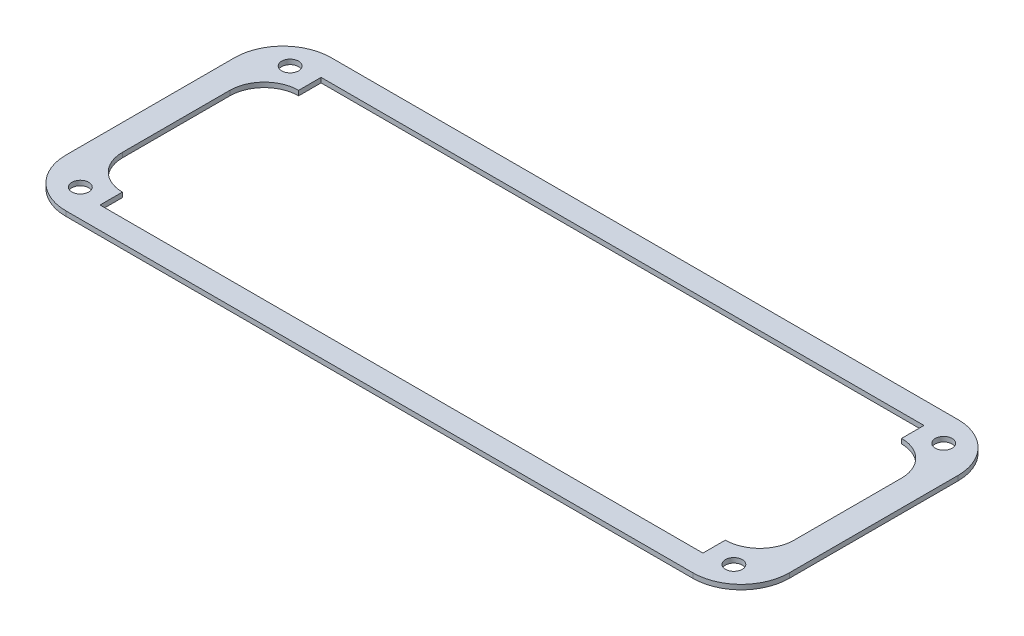
ISO-10303-21;
HEADER;
FILE_DESCRIPTION(('STEP AP214'),'2;1');
FILE_NAME('part.step','',(''),(''),'','','');
FILE_SCHEMA(('AUTOMOTIVE_DESIGN { 1 0 10303 214 1 1 1 1 }'));
ENDSEC;
DATA;
#1=APPLICATION_CONTEXT('core data for automotive mechanical design processes');
#2=APPLICATION_PROTOCOL_DEFINITION('international standard','automotive_design',2000,#1);
#3=PRODUCT_CONTEXT('',#1,'mechanical');
#4=PRODUCT('Part','Part','',(#3));
#5=PRODUCT_RELATED_PRODUCT_CATEGORY('part','',(#4));
#6=PRODUCT_DEFINITION_FORMATION('','',#4);
#7=PRODUCT_DEFINITION_CONTEXT('part definition',#1,'design');
#8=PRODUCT_DEFINITION('design','',#6,#7);
#9=PRODUCT_DEFINITION_SHAPE('','',#8);
#10=(LENGTH_UNIT() NAMED_UNIT(*) SI_UNIT(.MILLI.,.METRE.));
#11=(NAMED_UNIT(*) PLANE_ANGLE_UNIT() SI_UNIT($,.RADIAN.));
#12=(NAMED_UNIT(*) SI_UNIT($,.STERADIAN.) SOLID_ANGLE_UNIT());
#13=UNCERTAINTY_MEASURE_WITH_UNIT(LENGTH_MEASURE(1.E-05),#10,'distance_accuracy_value','');
#14=(GEOMETRIC_REPRESENTATION_CONTEXT(3) GLOBAL_UNCERTAINTY_ASSIGNED_CONTEXT((#13)) GLOBAL_UNIT_ASSIGNED_CONTEXT((#10,
#11,#12)) REPRESENTATION_CONTEXT('',''));
#15=CARTESIAN_POINT('',(0.,0.,0.));
#16=DIRECTION('',(0.,0.,1.));
#17=DIRECTION('',(1.,0.,0.));
#18=AXIS2_PLACEMENT_3D('',#15,#16,#17);
#19=CARTESIAN_POINT('',(132.75,1.,-4.25000000000001));
#20=DIRECTION('',(0.,1.,0.));
#21=DIRECTION('',(0.,0.,1.));
#22=AXIS2_PLACEMENT_3D('',#19,#20,#21);
#23=PLANE('',#22);
#24=CARTESIAN_POINT('',(135.5,1.,-43.5));
#25=DIRECTION('',(0.,1.,0.));
#26=DIRECTION('',(0.,0.,1.));
#27=AXIS2_PLACEMENT_3D('',#24,#25,#26);
#28=CIRCLE('',#27,1.75000000000001);
#29=CARTESIAN_POINT('',(135.5,1.,-41.75));
#30=VERTEX_POINT('',#29);
#31=EDGE_CURVE('E314',#30,#30,#28,.T.);
#32=ORIENTED_EDGE('',*,*,#31,.F.);
#33=EDGE_LOOP('',(#32));
#34=FACE_BOUND('',#33,.T.);
#35=CARTESIAN_POINT('',(0.,1.,0.));
#36=DIRECTION('',(0.,1.,0.));
#37=DIRECTION('',(0.,0.,1.));
#38=AXIS2_PLACEMENT_3D('',#35,#36,#37);
#39=CIRCLE('',#38,1.75);
#40=CARTESIAN_POINT('',(0.,1.,1.75));
#41=VERTEX_POINT('',#40);
#42=EDGE_CURVE('E330',#41,#41,#39,.T.);
#43=ORIENTED_EDGE('',*,*,#42,.F.);
#44=EDGE_LOOP('',(#43));
#45=FACE_BOUND('',#44,.T.);
#46=CARTESIAN_POINT('',(132.75,1.,-4.25000000000001));
#47=DIRECTION('',(0.,1.,0.));
#48=DIRECTION('',(0.,0.,1.));
#49=AXIS2_PLACEMENT_3D('',#46,#47,#48);
#50=CIRCLE('',#49,10.);
#51=CARTESIAN_POINT('',(132.75,1.,5.74999999999999));
#52=VERTEX_POINT('',#51);
#53=CARTESIAN_POINT('',(142.75,1.,-4.25000000000008));
#54=VERTEX_POINT('',#53);
#55=EDGE_CURVE('E338',#52,#54,#50,.T.);
#56=ORIENTED_EDGE('',*,*,#55,.T.);
#57=DIRECTION('',(0.,0.,-1.));
#58=VECTOR('',#57,1.);
#59=CARTESIAN_POINT('',(142.75,1.,-4.25000000000008));
#60=LINE('',#59,#58);
#61=CARTESIAN_POINT('',(142.75,1.,-39.2499999999999));
#62=VERTEX_POINT('',#61);
#63=EDGE_CURVE('E342',#54,#62,#60,.T.);
#64=ORIENTED_EDGE('',*,*,#63,.T.);
#65=CARTESIAN_POINT('',(132.75,1.,-39.25));
#66=DIRECTION('',(0.,1.,0.));
#67=DIRECTION('',(0.,0.,1.));
#68=AXIS2_PLACEMENT_3D('',#65,#66,#67);
#69=CIRCLE('',#68,10.);
#70=CARTESIAN_POINT('',(132.75,1.,-49.25));
#71=VERTEX_POINT('',#70);
#72=EDGE_CURVE('E346',#62,#71,#69,.T.);
#73=ORIENTED_EDGE('',*,*,#72,.T.);
#74=DIRECTION('',(-1.,0.,0.));
#75=VECTOR('',#74,1.);
#76=CARTESIAN_POINT('',(132.75,1.,-49.25));
#77=LINE('',#76,#75);
#78=CARTESIAN_POINT('',(2.75000000000011,1.,-49.25));
#79=VERTEX_POINT('',#78);
#80=EDGE_CURVE('E349',#71,#79,#77,.T.);
#81=ORIENTED_EDGE('',*,*,#80,.T.);
#82=CARTESIAN_POINT('',(2.75000000000004,1.,-39.25));
#83=DIRECTION('',(0.,1.,0.));
#84=DIRECTION('',(0.,0.,1.));
#85=AXIS2_PLACEMENT_3D('',#82,#83,#84);
#86=CIRCLE('',#85,10.);
#87=CARTESIAN_POINT('',(-7.24999999999996,1.,-39.2499999999999));
#88=VERTEX_POINT('',#87);
#89=EDGE_CURVE('E352',#79,#88,#86,.T.);
#90=ORIENTED_EDGE('',*,*,#89,.T.);
#91=DIRECTION('',(0.,0.,1.));
#92=VECTOR('',#91,1.);
#93=CARTESIAN_POINT('',(-7.24999999999996,1.,-4.25000000000006));
#94=LINE('',#93,#92);
#95=CARTESIAN_POINT('',(-7.24999999999996,1.,-4.25000000000006));
#96=VERTEX_POINT('',#95);
#97=EDGE_CURVE('E355',#88,#96,#94,.T.);
#98=ORIENTED_EDGE('',*,*,#97,.T.);
#99=CARTESIAN_POINT('',(2.75000000000003,1.,-4.24999999999999));
#100=DIRECTION('',(0.,1.,0.));
#101=DIRECTION('',(0.,0.,-1.));
#102=AXIS2_PLACEMENT_3D('',#99,#100,#101);
#103=CIRCLE('',#102,10.);
#104=CARTESIAN_POINT('',(2.75000000000011,1.,5.75000000000001));
#105=VERTEX_POINT('',#104);
#106=EDGE_CURVE('E358',#96,#105,#103,.T.);
#107=ORIENTED_EDGE('',*,*,#106,.T.);
#108=DIRECTION('',(1.,0.,0.));
#109=VECTOR('',#108,1.);
#110=CARTESIAN_POINT('',(132.75,1.,5.74999999999999));
#111=LINE('',#110,#109);
#112=EDGE_CURVE('E361',#105,#52,#111,.T.);
#113=ORIENTED_EDGE('',*,*,#112,.T.);
#114=EDGE_LOOP('',(#56,#64,#73,#81,#90,#98,#107,#113));
#115=FACE_BOUND('',#114,.T.);
#116=CARTESIAN_POINT('',(0.,1.,-43.5));
#117=DIRECTION('',(0.,1.,0.));
#118=DIRECTION('',(0.,0.,1.));
#119=AXIS2_PLACEMENT_3D('',#116,#117,#118);
#120=CIRCLE('',#119,1.75);
#121=CARTESIAN_POINT('',(0.,1.,-41.75));
#122=VERTEX_POINT('',#121);
#123=EDGE_CURVE('E322',#122,#122,#120,.T.);
#124=ORIENTED_EDGE('',*,*,#123,.F.);
#125=EDGE_LOOP('',(#124));
#126=FACE_BOUND('',#125,.T.);
#127=CARTESIAN_POINT('',(135.5,1.,0.));
#128=DIRECTION('',(0.,1.,0.));
#129=DIRECTION('',(0.,0.,1.));
#130=AXIS2_PLACEMENT_3D('',#127,#128,#129);
#131=CIRCLE('',#130,1.75000000000001);
#132=CARTESIAN_POINT('',(135.5,1.,1.75000000000001));
#133=VERTEX_POINT('',#132);
#134=EDGE_CURVE('E306',#133,#133,#131,.T.);
#135=ORIENTED_EDGE('',*,*,#134,.F.);
#136=EDGE_LOOP('',(#135));
#137=FACE_BOUND('',#136,.T.);
#138=CARTESIAN_POINT('',(5.25000000000002,1.,-32.8864434634646));
#139=DIRECTION('',(0.,1.,0.));
#140=DIRECTION('',(0.,0.,1.));
#141=AXIS2_PLACEMENT_3D('',#138,#139,#140);
#142=CIRCLE('',#141,7.13380773277468);
#143=CARTESIAN_POINT('',(5.25000000000002,1.,-40.0202511962393));
#144=VERTEX_POINT('',#143);
#145=CARTESIAN_POINT('',(-1.88380773277467,1.,-32.8864434634646));
#146=VERTEX_POINT('',#145);
#147=EDGE_CURVE('E186',#144,#146,#142,.T.);
#148=ORIENTED_EDGE('',*,*,#147,.F.);
#149=DIRECTION('',(0.,0.,1.));
#150=VECTOR('',#149,1.);
#151=CARTESIAN_POINT('',(5.25000000000002,1.,-40.0202511962393));
#152=LINE('',#151,#150);
#153=CARTESIAN_POINT('',(5.25000000000002,1.,-44.6666666666667));
#154=VERTEX_POINT('',#153);
#155=EDGE_CURVE('E177',#154,#144,#152,.T.);
#156=ORIENTED_EDGE('',*,*,#155,.F.);
#157=DIRECTION('',(-1.,0.,0.));
#158=VECTOR('',#157,1.);
#159=CARTESIAN_POINT('',(130.25,1.,-44.6666666666667));
#160=LINE('',#159,#158);
#161=CARTESIAN_POINT('',(130.25,1.,-44.6666666666667));
#162=VERTEX_POINT('',#161);
#163=EDGE_CURVE('E230',#162,#154,#160,.T.);
#164=ORIENTED_EDGE('',*,*,#163,.F.);
#165=DIRECTION('',(0.,0.,-1.));
#166=VECTOR('',#165,1.);
#167=CARTESIAN_POINT('',(130.25,1.,-40.0164434634646));
#168=LINE('',#167,#166);
#169=CARTESIAN_POINT('',(130.25,1.,-40.0164434634646));
#170=VERTEX_POINT('',#169);
#171=EDGE_CURVE('E227',#170,#162,#168,.T.);
#172=ORIENTED_EDGE('',*,*,#171,.F.);
#173=CARTESIAN_POINT('',(130.25,1.,-32.8864434634646));
#174=DIRECTION('',(0.,1.,0.));
#175=DIRECTION('',(0.,0.,1.));
#176=AXIS2_PLACEMENT_3D('',#173,#174,#175);
#177=CIRCLE('',#176,7.12999999999997);
#178=CARTESIAN_POINT('',(137.38,1.,-32.8864434634646));
#179=VERTEX_POINT('',#178);
#180=EDGE_CURVE('E224',#179,#170,#177,.T.);
#181=ORIENTED_EDGE('',*,*,#180,.F.);
#182=DIRECTION('',(0.,0.,-1.));
#183=VECTOR('',#182,1.);
#184=CARTESIAN_POINT('',(137.38,1.,-10.6135565365355));
#185=LINE('',#184,#183);
#186=CARTESIAN_POINT('',(137.38,1.,-10.6135565365355));
#187=VERTEX_POINT('',#186);
#188=EDGE_CURVE('E221',#187,#179,#185,.T.);
#189=ORIENTED_EDGE('',*,*,#188,.F.);
#190=CARTESIAN_POINT('',(130.25,1.,-10.6135565365354));
#191=DIRECTION('',(0.,1.,0.));
#192=DIRECTION('',(0.,0.,1.));
#193=AXIS2_PLACEMENT_3D('',#190,#191,#192);
#194=CIRCLE('',#193,7.12999999999997);
#195=CARTESIAN_POINT('',(130.25,1.,-3.48355653653547));
#196=VERTEX_POINT('',#195);
#197=EDGE_CURVE('E218',#196,#187,#194,.T.);
#198=ORIENTED_EDGE('',*,*,#197,.F.);
#199=DIRECTION('',(0.,0.,-1.));
#200=VECTOR('',#199,1.);
#201=CARTESIAN_POINT('',(130.25,1.,1.16666666666665));
#202=LINE('',#201,#200);
#203=CARTESIAN_POINT('',(130.25,1.,1.16666666666665));
#204=VERTEX_POINT('',#203);
#205=EDGE_CURVE('E215',#204,#196,#202,.T.);
#206=ORIENTED_EDGE('',*,*,#205,.F.);
#207=DIRECTION('',(1.,0.,0.));
#208=VECTOR('',#207,1.);
#209=CARTESIAN_POINT('',(130.25,1.,1.16666666666665));
#210=LINE('',#209,#208);
#211=CARTESIAN_POINT('',(5.25000000000002,1.,1.16666666666666));
#212=VERTEX_POINT('',#211);
#213=EDGE_CURVE('E212',#212,#204,#210,.T.);
#214=ORIENTED_EDGE('',*,*,#213,.F.);
#215=DIRECTION('',(0.,0.,1.));
#216=VECTOR('',#215,1.);
#217=CARTESIAN_POINT('',(5.25000000000002,1.,1.16666666666666));
#218=LINE('',#217,#216);
#219=CARTESIAN_POINT('',(5.25000000000002,1.,-3.47974880376073));
#220=VERTEX_POINT('',#219);
#221=EDGE_CURVE('E209',#220,#212,#218,.T.);
#222=ORIENTED_EDGE('',*,*,#221,.F.);
#223=CARTESIAN_POINT('',(5.25000000000002,1.,-10.6135565365354));
#224=DIRECTION('',(0.,1.,0.));
#225=DIRECTION('',(0.,0.,1.));
#226=AXIS2_PLACEMENT_3D('',#223,#224,#225);
#227=CIRCLE('',#226,7.13380773277468);
#228=CARTESIAN_POINT('',(-1.88380773277466,1.,-10.6135565365354));
#229=VERTEX_POINT('',#228);
#230=EDGE_CURVE('E204',#229,#220,#227,.T.);
#231=ORIENTED_EDGE('',*,*,#230,.F.);
#232=DIRECTION('',(0.,0.,1.));
#233=VECTOR('',#232,1.);
#234=CARTESIAN_POINT('',(-1.88380773277466,1.,-10.6135565365354));
#235=LINE('',#234,#233);
#236=EDGE_CURVE('E200',#146,#229,#235,.T.);
#237=ORIENTED_EDGE('',*,*,#236,.F.);
#238=EDGE_LOOP('',(#148,#156,#164,#172,#181,#189,#198,#206,#214,#222,#231,#237));
#239=FACE_BOUND('',#238,.T.);
#240=ADVANCED_FACE('F39',(#34,#45,#115,#126,#137,#239),#23,.T.);
#241=CARTESIAN_POINT('',(132.75,0.,-4.25000000000001));
#242=DIRECTION('',(0.,1.,0.));
#243=DIRECTION('',(0.,0.,1.));
#244=AXIS2_PLACEMENT_3D('',#241,#242,#243);
#245=PLANE('',#244);
#246=CARTESIAN_POINT('',(135.5,0.,0.));
#247=DIRECTION('',(0.,1.,0.));
#248=DIRECTION('',(0.,0.,1.));
#249=AXIS2_PLACEMENT_3D('',#246,#247,#248);
#250=CIRCLE('',#249,1.75000000000001);
#251=CARTESIAN_POINT('',(135.5,0.,1.75000000000001));
#252=VERTEX_POINT('',#251);
#253=EDGE_CURVE('E195',#252,#252,#250,.T.);
#254=ORIENTED_EDGE('',*,*,#253,.T.);
#255=EDGE_LOOP('',(#254));
#256=FACE_BOUND('',#255,.T.);
#257=CARTESIAN_POINT('',(135.5,0.,-43.5));
#258=DIRECTION('',(0.,1.,0.));
#259=DIRECTION('',(0.,0.,1.));
#260=AXIS2_PLACEMENT_3D('',#257,#258,#259);
#261=CIRCLE('',#260,1.75000000000001);
#262=CARTESIAN_POINT('',(135.5,0.,-41.75));
#263=VERTEX_POINT('',#262);
#264=EDGE_CURVE('E310',#263,#263,#261,.T.);
#265=ORIENTED_EDGE('',*,*,#264,.T.);
#266=EDGE_LOOP('',(#265));
#267=FACE_BOUND('',#266,.T.);
#268=CARTESIAN_POINT('',(0.,0.,-43.5));
#269=DIRECTION('',(0.,1.,0.));
#270=DIRECTION('',(0.,0.,1.));
#271=AXIS2_PLACEMENT_3D('',#268,#269,#270);
#272=CIRCLE('',#271,1.75);
#273=CARTESIAN_POINT('',(0.,0.,-41.75));
#274=VERTEX_POINT('',#273);
#275=EDGE_CURVE('E318',#274,#274,#272,.T.);
#276=ORIENTED_EDGE('',*,*,#275,.T.);
#277=EDGE_LOOP('',(#276));
#278=FACE_BOUND('',#277,.T.);
#279=CARTESIAN_POINT('',(0.,0.,0.));
#280=DIRECTION('',(0.,1.,0.));
#281=DIRECTION('',(0.,0.,1.));
#282=AXIS2_PLACEMENT_3D('',#279,#280,#281);
#283=CIRCLE('',#282,1.75);
#284=CARTESIAN_POINT('',(0.,0.,1.75));
#285=VERTEX_POINT('',#284);
#286=EDGE_CURVE('E326',#285,#285,#283,.T.);
#287=ORIENTED_EDGE('',*,*,#286,.T.);
#288=EDGE_LOOP('',(#287));
#289=FACE_BOUND('',#288,.T.);
#290=CARTESIAN_POINT('',(132.75,0.,-4.25000000000001));
#291=DIRECTION('',(0.,1.,0.));
#292=DIRECTION('',(0.,0.,1.));
#293=AXIS2_PLACEMENT_3D('',#290,#291,#292);
#294=CIRCLE('',#293,10.);
#295=CARTESIAN_POINT('',(132.75,0.,5.74999999999999));
#296=VERTEX_POINT('',#295);
#297=CARTESIAN_POINT('',(142.75,0.,-4.25000000000008));
#298=VERTEX_POINT('',#297);
#299=EDGE_CURVE('E334',#296,#298,#294,.T.);
#300=ORIENTED_EDGE('',*,*,#299,.F.);
#301=DIRECTION('',(1.,0.,0.));
#302=VECTOR('',#301,1.);
#303=CARTESIAN_POINT('',(132.75,0.,5.74999999999999));
#304=LINE('',#303,#302);
#305=CARTESIAN_POINT('',(2.75000000000011,0.,5.75000000000001));
#306=VERTEX_POINT('',#305);
#307=EDGE_CURVE('E343',#306,#296,#304,.T.);
#308=ORIENTED_EDGE('',*,*,#307,.F.);
#309=CARTESIAN_POINT('',(2.75000000000003,0.,-4.24999999999999));
#310=DIRECTION('',(0.,1.,0.));
#311=DIRECTION('',(0.,0.,-1.));
#312=AXIS2_PLACEMENT_3D('',#309,#310,#311);
#313=CIRCLE('',#312,10.);
#314=CARTESIAN_POINT('',(-7.24999999999996,0.,-4.25000000000006));
#315=VERTEX_POINT('',#314);
#316=EDGE_CURVE('E383',#315,#306,#313,.T.);
#317=ORIENTED_EDGE('',*,*,#316,.F.);
#318=DIRECTION('',(0.,0.,1.));
#319=VECTOR('',#318,1.);
#320=CARTESIAN_POINT('',(-7.24999999999996,0.,-4.25000000000006));
#321=LINE('',#320,#319);
#322=CARTESIAN_POINT('',(-7.24999999999996,0.,-39.2499999999999));
#323=VERTEX_POINT('',#322);
#324=EDGE_CURVE('E380',#323,#315,#321,.T.);
#325=ORIENTED_EDGE('',*,*,#324,.F.);
#326=CARTESIAN_POINT('',(2.75000000000004,0.,-39.25));
#327=DIRECTION('',(0.,1.,0.));
#328=DIRECTION('',(0.,0.,1.));
#329=AXIS2_PLACEMENT_3D('',#326,#327,#328);
#330=CIRCLE('',#329,10.);
#331=CARTESIAN_POINT('',(2.75000000000011,0.,-49.25));
#332=VERTEX_POINT('',#331);
#333=EDGE_CURVE('E377',#332,#323,#330,.T.);
#334=ORIENTED_EDGE('',*,*,#333,.F.);
#335=DIRECTION('',(-1.,0.,0.));
#336=VECTOR('',#335,1.);
#337=CARTESIAN_POINT('',(132.75,0.,-49.25));
#338=LINE('',#337,#336);
#339=CARTESIAN_POINT('',(132.75,0.,-49.25));
#340=VERTEX_POINT('',#339);
#341=EDGE_CURVE('E374',#340,#332,#338,.T.);
#342=ORIENTED_EDGE('',*,*,#341,.F.);
#343=CARTESIAN_POINT('',(132.75,0.,-39.25));
#344=DIRECTION('',(0.,1.,0.));
#345=DIRECTION('',(0.,0.,1.));
#346=AXIS2_PLACEMENT_3D('',#343,#344,#345);
#347=CIRCLE('',#346,10.);
#348=CARTESIAN_POINT('',(142.75,0.,-39.2499999999999));
#349=VERTEX_POINT('',#348);
#350=EDGE_CURVE('E371',#349,#340,#347,.T.);
#351=ORIENTED_EDGE('',*,*,#350,.F.);
#352=DIRECTION('',(0.,0.,-1.));
#353=VECTOR('',#352,1.);
#354=CARTESIAN_POINT('',(142.75,0.,-4.25000000000008));
#355=LINE('',#354,#353);
#356=EDGE_CURVE('E368',#298,#349,#355,.T.);
#357=ORIENTED_EDGE('',*,*,#356,.F.);
#358=EDGE_LOOP('',(#300,#308,#317,#325,#334,#342,#351,#357));
#359=FACE_BOUND('',#358,.T.);
#360=DIRECTION('',(0.,0.,1.));
#361=VECTOR('',#360,1.);
#362=CARTESIAN_POINT('',(5.25000000000002,0.,-40.0202511962393));
#363=LINE('',#362,#361);
#364=CARTESIAN_POINT('',(5.25,0.,-44.6666666666667));
#365=VERTEX_POINT('',#364);
#366=CARTESIAN_POINT('',(5.25000000000002,0.,-40.0202511962393));
#367=VERTEX_POINT('',#366);
#368=EDGE_CURVE('E63',#365,#367,#363,.T.);
#369=ORIENTED_EDGE('',*,*,#368,.T.);
#370=CARTESIAN_POINT('',(5.25000000000002,0.,-32.8864434634646));
#371=DIRECTION('',(0.,1.,0.));
#372=DIRECTION('',(0.,0.,1.));
#373=AXIS2_PLACEMENT_3D('',#370,#371,#372);
#374=CIRCLE('',#373,7.13380773277468);
#375=CARTESIAN_POINT('',(-1.88380773277467,0.,-32.8864434634646));
#376=VERTEX_POINT('',#375);
#377=EDGE_CURVE('E193',#367,#376,#374,.T.);
#378=ORIENTED_EDGE('',*,*,#377,.T.);
#379=DIRECTION('',(0.,0.,1.));
#380=VECTOR('',#379,1.);
#381=CARTESIAN_POINT('',(-1.88380773277466,0.,-10.6135565365354));
#382=LINE('',#381,#380);
#383=CARTESIAN_POINT('',(-1.88380773277466,0.,-10.6135565365354));
#384=VERTEX_POINT('',#383);
#385=EDGE_CURVE('E237',#376,#384,#382,.T.);
#386=ORIENTED_EDGE('',*,*,#385,.T.);
#387=CARTESIAN_POINT('',(5.25000000000002,0.,-10.6135565365354));
#388=DIRECTION('',(0.,1.,0.));
#389=DIRECTION('',(0.,0.,1.));
#390=AXIS2_PLACEMENT_3D('',#387,#388,#389);
#391=CIRCLE('',#390,7.13380773277468);
#392=CARTESIAN_POINT('',(5.25000000000002,0.,-3.47974880376073));
#393=VERTEX_POINT('',#392);
#394=EDGE_CURVE('E241',#384,#393,#391,.T.);
#395=ORIENTED_EDGE('',*,*,#394,.T.);
#396=DIRECTION('',(0.,0.,1.));
#397=VECTOR('',#396,1.);
#398=CARTESIAN_POINT('',(5.25000000000002,0.,1.16666666666666));
#399=LINE('',#398,#397);
#400=CARTESIAN_POINT('',(5.25000000000002,0.,1.16666666666666));
#401=VERTEX_POINT('',#400);
#402=EDGE_CURVE('E245',#393,#401,#399,.T.);
#403=ORIENTED_EDGE('',*,*,#402,.T.);
#404=DIRECTION('',(1.,0.,0.));
#405=VECTOR('',#404,1.);
#406=CARTESIAN_POINT('',(130.25,0.,1.16666666666665));
#407=LINE('',#406,#405);
#408=CARTESIAN_POINT('',(130.25,0.,1.16666666666665));
#409=VERTEX_POINT('',#408);
#410=EDGE_CURVE('E249',#401,#409,#407,.T.);
#411=ORIENTED_EDGE('',*,*,#410,.T.);
#412=DIRECTION('',(0.,0.,-1.));
#413=VECTOR('',#412,1.);
#414=CARTESIAN_POINT('',(130.25,0.,1.16666666666665));
#415=LINE('',#414,#413);
#416=CARTESIAN_POINT('',(130.25,0.,-3.48355653653547));
#417=VERTEX_POINT('',#416);
#418=EDGE_CURVE('E253',#409,#417,#415,.T.);
#419=ORIENTED_EDGE('',*,*,#418,.T.);
#420=CARTESIAN_POINT('',(130.25,0.,-10.6135565365354));
#421=DIRECTION('',(0.,1.,0.));
#422=DIRECTION('',(0.,0.,1.));
#423=AXIS2_PLACEMENT_3D('',#420,#421,#422);
#424=CIRCLE('',#423,7.12999999999997);
#425=CARTESIAN_POINT('',(137.38,0.,-10.6135565365355));
#426=VERTEX_POINT('',#425);
#427=EDGE_CURVE('E257',#417,#426,#424,.T.);
#428=ORIENTED_EDGE('',*,*,#427,.T.);
#429=DIRECTION('',(0.,0.,-1.));
#430=VECTOR('',#429,1.);
#431=CARTESIAN_POINT('',(137.38,0.,-10.6135565365355));
#432=LINE('',#431,#430);
#433=CARTESIAN_POINT('',(137.38,0.,-32.8864434634646));
#434=VERTEX_POINT('',#433);
#435=EDGE_CURVE('E261',#426,#434,#432,.T.);
#436=ORIENTED_EDGE('',*,*,#435,.T.);
#437=CARTESIAN_POINT('',(130.25,0.,-32.8864434634646));
#438=DIRECTION('',(0.,1.,0.));
#439=DIRECTION('',(0.,0.,1.));
#440=AXIS2_PLACEMENT_3D('',#437,#438,#439);
#441=CIRCLE('',#440,7.12999999999997);
#442=CARTESIAN_POINT('',(130.25,0.,-40.0164434634646));
#443=VERTEX_POINT('',#442);
#444=EDGE_CURVE('E265',#434,#443,#441,.T.);
#445=ORIENTED_EDGE('',*,*,#444,.T.);
#446=DIRECTION('',(0.,0.,-1.));
#447=VECTOR('',#446,1.);
#448=CARTESIAN_POINT('',(130.25,0.,-40.0164434634646));
#449=LINE('',#448,#447);
#450=CARTESIAN_POINT('',(130.25,0.,-44.6666666666667));
#451=VERTEX_POINT('',#450);
#452=EDGE_CURVE('E269',#443,#451,#449,.T.);
#453=ORIENTED_EDGE('',*,*,#452,.T.);
#454=DIRECTION('',(-1.,0.,0.));
#455=VECTOR('',#454,1.);
#456=CARTESIAN_POINT('',(130.25,0.,-44.6666666666667));
#457=LINE('',#456,#455);
#458=EDGE_CURVE('E187',#451,#365,#457,.T.);
#459=ORIENTED_EDGE('',*,*,#458,.T.);
#460=EDGE_LOOP('',(#369,#378,#386,#395,#403,#411,#419,#428,#436,#445,#453,#459));
#461=FACE_BOUND('',#460,.T.);
#462=ADVANCED_FACE('F422',(#256,#267,#278,#289,#359,#461),#245,.F.);
#463=CARTESIAN_POINT('',(132.75,1.,-4.25000000000001));
#464=DIRECTION('',(0.,-1.,0.));
#465=DIRECTION('',(0.,0.,-1.));
#466=AXIS2_PLACEMENT_3D('',#463,#464,#465);
#467=CYLINDRICAL_SURFACE('',#466,10.);
#468=ORIENTED_EDGE('',*,*,#299,.T.);
#469=DIRECTION('',(0.,-1.,0.));
#470=VECTOR('',#469,1.);
#471=CARTESIAN_POINT('',(142.75,1.,-4.25000000000008));
#472=LINE('',#471,#470);
#473=EDGE_CURVE('E11',#54,#298,#472,.T.);
#474=ORIENTED_EDGE('',*,*,#473,.F.);
#475=ORIENTED_EDGE('',*,*,#55,.F.);
#476=DIRECTION('',(0.,-1.,0.));
#477=VECTOR('',#476,1.);
#478=CARTESIAN_POINT('',(132.75,1.,5.74999999999999));
#479=LINE('',#478,#477);
#480=EDGE_CURVE('E364',#52,#296,#479,.T.);
#481=ORIENTED_EDGE('',*,*,#480,.T.);
#482=EDGE_LOOP('',(#468,#474,#475,#481));
#483=FACE_BOUND('',#482,.T.);
#484=ADVANCED_FACE('F41',(#483),#467,.T.);
#485=CARTESIAN_POINT('',(142.75,1.,-4.25000000000008));
#486=DIRECTION('',(-1.,0.,0.));
#487=DIRECTION('',(0.,0.,1.));
#488=AXIS2_PLACEMENT_3D('',#485,#486,#487);
#489=PLANE('',#488);
#490=ORIENTED_EDGE('',*,*,#356,.T.);
#491=DIRECTION('',(0.,-1.,0.));
#492=VECTOR('',#491,1.);
#493=CARTESIAN_POINT('',(142.75,1.,-39.2499999999999));
#494=LINE('',#493,#492);
#495=EDGE_CURVE('E48',#62,#349,#494,.T.);
#496=ORIENTED_EDGE('',*,*,#495,.F.);
#497=ORIENTED_EDGE('',*,*,#63,.F.);
#498=ORIENTED_EDGE('',*,*,#473,.T.);
#499=EDGE_LOOP('',(#490,#496,#497,#498));
#500=FACE_BOUND('',#499,.T.);
#501=ADVANCED_FACE('F440',(#500),#489,.F.);
#502=CARTESIAN_POINT('',(132.75,1.,-39.25));
#503=DIRECTION('',(0.,-1.,0.));
#504=DIRECTION('',(0.,0.,-1.));
#505=AXIS2_PLACEMENT_3D('',#502,#503,#504);
#506=CYLINDRICAL_SURFACE('',#505,10.);
#507=ORIENTED_EDGE('',*,*,#350,.T.);
#508=DIRECTION('',(0.,-1.,0.));
#509=VECTOR('',#508,1.);
#510=CARTESIAN_POINT('',(132.75,1.,-49.25));
#511=LINE('',#510,#509);
#512=EDGE_CURVE('E407',#71,#340,#511,.T.);
#513=ORIENTED_EDGE('',*,*,#512,.F.);
#514=ORIENTED_EDGE('',*,*,#72,.F.);
#515=ORIENTED_EDGE('',*,*,#495,.T.);
#516=EDGE_LOOP('',(#507,#513,#514,#515));
#517=FACE_BOUND('',#516,.T.);
#518=ADVANCED_FACE('F416',(#517),#506,.T.);
#519=CARTESIAN_POINT('',(132.75,1.,-49.25));
#520=DIRECTION('',(0.,0.,1.));
#521=DIRECTION('',(1.,0.,0.));
#522=AXIS2_PLACEMENT_3D('',#519,#520,#521);
#523=PLANE('',#522);
#524=ORIENTED_EDGE('',*,*,#341,.T.);
#525=DIRECTION('',(0.,-1.,0.));
#526=VECTOR('',#525,1.);
#527=CARTESIAN_POINT('',(2.75000000000011,1.,-49.25));
#528=LINE('',#527,#526);
#529=EDGE_CURVE('E403',#79,#332,#528,.T.);
#530=ORIENTED_EDGE('',*,*,#529,.F.);
#531=ORIENTED_EDGE('',*,*,#80,.F.);
#532=ORIENTED_EDGE('',*,*,#512,.T.);
#533=EDGE_LOOP('',(#524,#530,#531,#532));
#534=FACE_BOUND('',#533,.T.);
#535=ADVANCED_FACE('F428',(#534),#523,.F.);
#536=CARTESIAN_POINT('',(2.75000000000004,1.,-39.25));
#537=DIRECTION('',(0.,-1.,0.));
#538=DIRECTION('',(0.,0.,-1.));
#539=AXIS2_PLACEMENT_3D('',#536,#537,#538);
#540=CYLINDRICAL_SURFACE('',#539,10.);
#541=ORIENTED_EDGE('',*,*,#333,.T.);
#542=DIRECTION('',(0.,-1.,0.));
#543=VECTOR('',#542,1.);
#544=CARTESIAN_POINT('',(-7.24999999999996,1.,-39.2499999999999));
#545=LINE('',#544,#543);
#546=EDGE_CURVE('E399',#88,#323,#545,.T.);
#547=ORIENTED_EDGE('',*,*,#546,.F.);
#548=ORIENTED_EDGE('',*,*,#89,.F.);
#549=ORIENTED_EDGE('',*,*,#529,.T.);
#550=EDGE_LOOP('',(#541,#547,#548,#549));
#551=FACE_BOUND('',#550,.T.);
#552=ADVANCED_FACE('F432',(#551),#540,.T.);
#553=CARTESIAN_POINT('',(-7.24999999999996,1.,-4.25000000000006));
#554=DIRECTION('',(1.,0.,0.));
#555=DIRECTION('',(0.,0.,-1.));
#556=AXIS2_PLACEMENT_3D('',#553,#554,#555);
#557=PLANE('',#556);
#558=ORIENTED_EDGE('',*,*,#324,.T.);
#559=DIRECTION('',(0.,-1.,0.));
#560=VECTOR('',#559,1.);
#561=CARTESIAN_POINT('',(-7.24999999999996,1.,-4.25000000000006));
#562=LINE('',#561,#560);
#563=EDGE_CURVE('E395',#96,#315,#562,.T.);
#564=ORIENTED_EDGE('',*,*,#563,.F.);
#565=ORIENTED_EDGE('',*,*,#97,.F.);
#566=ORIENTED_EDGE('',*,*,#546,.T.);
#567=EDGE_LOOP('',(#558,#564,#565,#566));
#568=FACE_BOUND('',#567,.T.);
#569=ADVANCED_FACE('F453',(#568),#557,.F.);
#570=CARTESIAN_POINT('',(2.75000000000003,1.,-4.24999999999999));
#571=DIRECTION('',(0.,-1.,0.));
#572=DIRECTION('',(0.,0.,-1.));
#573=AXIS2_PLACEMENT_3D('',#570,#571,#572);
#574=CYLINDRICAL_SURFACE('',#573,10.);
#575=ORIENTED_EDGE('',*,*,#316,.T.);
#576=DIRECTION('',(0.,-1.,0.));
#577=VECTOR('',#576,1.);
#578=CARTESIAN_POINT('',(2.75000000000011,1.,5.75000000000001));
#579=LINE('',#578,#577);
#580=EDGE_CURVE('E391',#105,#306,#579,.T.);
#581=ORIENTED_EDGE('',*,*,#580,.F.);
#582=ORIENTED_EDGE('',*,*,#106,.F.);
#583=ORIENTED_EDGE('',*,*,#563,.T.);
#584=EDGE_LOOP('',(#575,#581,#582,#583));
#585=FACE_BOUND('',#584,.T.);
#586=ADVANCED_FACE('F451',(#585),#574,.T.);
#587=CARTESIAN_POINT('',(132.75,1.,5.74999999999999));
#588=DIRECTION('',(0.,0.,-1.));
#589=DIRECTION('',(-1.,0.,0.));
#590=AXIS2_PLACEMENT_3D('',#587,#588,#589);
#591=PLANE('',#590);
#592=ORIENTED_EDGE('',*,*,#307,.T.);
#593=ORIENTED_EDGE('',*,*,#480,.F.);
#594=ORIENTED_EDGE('',*,*,#112,.F.);
#595=ORIENTED_EDGE('',*,*,#580,.T.);
#596=EDGE_LOOP('',(#592,#593,#594,#595));
#597=FACE_BOUND('',#596,.T.);
#598=ADVANCED_FACE('F446',(#597),#591,.F.);
#599=CARTESIAN_POINT('',(0.,1.,0.));
#600=DIRECTION('',(0.,-1.,0.));
#601=DIRECTION('',(0.,0.,-1.));
#602=AXIS2_PLACEMENT_3D('',#599,#600,#601);
#603=CYLINDRICAL_SURFACE('',#602,1.75);
#604=ORIENTED_EDGE('',*,*,#42,.T.);
#605=EDGE_LOOP('',(#604));
#606=FACE_BOUND('',#605,.T.);
#607=ORIENTED_EDGE('',*,*,#286,.F.);
#608=EDGE_LOOP('',(#607));
#609=FACE_BOUND('',#608,.T.);
#610=ADVANCED_FACE('F473',(#606,#609),#603,.F.);
#611=CARTESIAN_POINT('',(0.,1.,-43.5));
#612=DIRECTION('',(0.,-1.,0.));
#613=DIRECTION('',(0.,0.,-1.));
#614=AXIS2_PLACEMENT_3D('',#611,#612,#613);
#615=CYLINDRICAL_SURFACE('',#614,1.75);
#616=ORIENTED_EDGE('',*,*,#123,.T.);
#617=EDGE_LOOP('',(#616));
#618=FACE_BOUND('',#617,.T.);
#619=ORIENTED_EDGE('',*,*,#275,.F.);
#620=EDGE_LOOP('',(#619));
#621=FACE_BOUND('',#620,.T.);
#622=ADVANCED_FACE('F480',(#618,#621),#615,.F.);
#623=CARTESIAN_POINT('',(135.5,1.,-43.5));
#624=DIRECTION('',(0.,-1.,0.));
#625=DIRECTION('',(0.,0.,-1.));
#626=AXIS2_PLACEMENT_3D('',#623,#624,#625);
#627=CYLINDRICAL_SURFACE('',#626,1.75000000000001);
#628=ORIENTED_EDGE('',*,*,#31,.T.);
#629=EDGE_LOOP('',(#628));
#630=FACE_BOUND('',#629,.T.);
#631=ORIENTED_EDGE('',*,*,#264,.F.);
#632=EDGE_LOOP('',(#631));
#633=FACE_BOUND('',#632,.T.);
#634=ADVANCED_FACE('F485',(#630,#633),#627,.F.);
#635=CARTESIAN_POINT('',(135.5,1.,0.));
#636=DIRECTION('',(0.,-1.,0.));
#637=DIRECTION('',(0.,0.,-1.));
#638=AXIS2_PLACEMENT_3D('',#635,#636,#637);
#639=CYLINDRICAL_SURFACE('',#638,1.75000000000001);
#640=ORIENTED_EDGE('',*,*,#134,.T.);
#641=EDGE_LOOP('',(#640));
#642=FACE_BOUND('',#641,.T.);
#643=ORIENTED_EDGE('',*,*,#253,.F.);
#644=EDGE_LOOP('',(#643));
#645=FACE_BOUND('',#644,.T.);
#646=ADVANCED_FACE('F494',(#642,#645),#639,.F.);
#647=CARTESIAN_POINT('',(5.25000000000002,1.,-40.0202511962393));
#648=DIRECTION('',(1.,0.,0.));
#649=DIRECTION('',(0.,0.,-1.));
#650=AXIS2_PLACEMENT_3D('',#647,#648,#649);
#651=PLANE('',#650);
#652=ORIENTED_EDGE('',*,*,#368,.F.);
#653=DIRECTION('',(0.,-1.,0.));
#654=VECTOR('',#653,1.);
#655=CARTESIAN_POINT('',(5.25000000000002,1.,-44.6666666666667));
#656=LINE('',#655,#654);
#657=EDGE_CURVE('E181',#154,#365,#656,.T.);
#658=ORIENTED_EDGE('',*,*,#657,.F.);
#659=ORIENTED_EDGE('',*,*,#155,.T.);
#660=DIRECTION('',(0.,-1.,0.));
#661=VECTOR('',#660,1.);
#662=CARTESIAN_POINT('',(5.25000000000002,1.,-40.0202511962393));
#663=LINE('',#662,#661);
#664=EDGE_CURVE('E180',#144,#367,#663,.T.);
#665=ORIENTED_EDGE('',*,*,#664,.T.);
#666=EDGE_LOOP('',(#652,#658,#659,#665));
#667=FACE_BOUND('',#666,.T.);
#668=ADVANCED_FACE('F179',(#667),#651,.T.);
#669=CARTESIAN_POINT('',(5.25000000000002,1.,-32.8864434634646));
#670=DIRECTION('',(0.,-1.,0.));
#671=DIRECTION('',(0.,0.,-1.));
#672=AXIS2_PLACEMENT_3D('',#669,#670,#671);
#673=CYLINDRICAL_SURFACE('',#672,7.13380773277468);
#674=ORIENTED_EDGE('',*,*,#377,.F.);
#675=ORIENTED_EDGE('',*,*,#664,.F.);
#676=ORIENTED_EDGE('',*,*,#147,.T.);
#677=DIRECTION('',(0.,-1.,0.));
#678=VECTOR('',#677,1.);
#679=CARTESIAN_POINT('',(-1.88380773277467,1.,-32.8864434634646));
#680=LINE('',#679,#678);
#681=EDGE_CURVE('E196',#146,#376,#680,.T.);
#682=ORIENTED_EDGE('',*,*,#681,.T.);
#683=EDGE_LOOP('',(#674,#675,#676,#682));
#684=FACE_BOUND('',#683,.T.);
#685=ADVANCED_FACE('F190',(#684),#673,.F.);
#686=CARTESIAN_POINT('',(-1.88380773277466,1.,-10.6135565365354));
#687=DIRECTION('',(1.,0.,0.));
#688=DIRECTION('',(0.,0.,-1.));
#689=AXIS2_PLACEMENT_3D('',#686,#687,#688);
#690=PLANE('',#689);
#691=ORIENTED_EDGE('',*,*,#385,.F.);
#692=ORIENTED_EDGE('',*,*,#681,.F.);
#693=ORIENTED_EDGE('',*,*,#236,.T.);
#694=DIRECTION('',(0.,-1.,0.));
#695=VECTOR('',#694,1.);
#696=CARTESIAN_POINT('',(-1.88380773277466,1.,-10.6135565365354));
#697=LINE('',#696,#695);
#698=EDGE_CURVE('E301',#229,#384,#697,.T.);
#699=ORIENTED_EDGE('',*,*,#698,.T.);
#700=EDGE_LOOP('',(#691,#692,#693,#699));
#701=FACE_BOUND('',#700,.T.);
#702=ADVANCED_FACE('F506',(#701),#690,.T.);
#703=CARTESIAN_POINT('',(5.25000000000002,1.,-10.6135565365354));
#704=DIRECTION('',(0.,-1.,0.));
#705=DIRECTION('',(0.,0.,-1.));
#706=AXIS2_PLACEMENT_3D('',#703,#704,#705);
#707=CYLINDRICAL_SURFACE('',#706,7.13380773277468);
#708=ORIENTED_EDGE('',*,*,#394,.F.);
#709=ORIENTED_EDGE('',*,*,#698,.F.);
#710=ORIENTED_EDGE('',*,*,#230,.T.);
#711=DIRECTION('',(0.,-1.,0.));
#712=VECTOR('',#711,1.);
#713=CARTESIAN_POINT('',(5.25000000000002,1.,-3.47974880376073));
#714=LINE('',#713,#712);
#715=EDGE_CURVE('E298',#220,#393,#714,.T.);
#716=ORIENTED_EDGE('',*,*,#715,.T.);
#717=EDGE_LOOP('',(#708,#709,#710,#716));
#718=FACE_BOUND('',#717,.T.);
#719=ADVANCED_FACE('F509',(#718),#707,.F.);
#720=CARTESIAN_POINT('',(5.25000000000002,1.,1.16666666666666));
#721=DIRECTION('',(1.,0.,0.));
#722=DIRECTION('',(0.,0.,-1.));
#723=AXIS2_PLACEMENT_3D('',#720,#721,#722);
#724=PLANE('',#723);
#725=ORIENTED_EDGE('',*,*,#402,.F.);
#726=ORIENTED_EDGE('',*,*,#715,.F.);
#727=ORIENTED_EDGE('',*,*,#221,.T.);
#728=DIRECTION('',(0.,-1.,0.));
#729=VECTOR('',#728,1.);
#730=CARTESIAN_POINT('',(5.25000000000002,1.,1.16666666666666));
#731=LINE('',#730,#729);
#732=EDGE_CURVE('E295',#212,#401,#731,.T.);
#733=ORIENTED_EDGE('',*,*,#732,.T.);
#734=EDGE_LOOP('',(#725,#726,#727,#733));
#735=FACE_BOUND('',#734,.T.);
#736=ADVANCED_FACE('F513',(#735),#724,.T.);
#737=CARTESIAN_POINT('',(130.25,1.,1.16666666666665));
#738=DIRECTION('',(0.,0.,-1.));
#739=DIRECTION('',(-1.,0.,0.));
#740=AXIS2_PLACEMENT_3D('',#737,#738,#739);
#741=PLANE('',#740);
#742=ORIENTED_EDGE('',*,*,#410,.F.);
#743=ORIENTED_EDGE('',*,*,#732,.F.);
#744=ORIENTED_EDGE('',*,*,#213,.T.);
#745=DIRECTION('',(0.,-1.,0.));
#746=VECTOR('',#745,1.);
#747=CARTESIAN_POINT('',(130.25,1.,1.16666666666665));
#748=LINE('',#747,#746);
#749=EDGE_CURVE('E292',#204,#409,#748,.T.);
#750=ORIENTED_EDGE('',*,*,#749,.T.);
#751=EDGE_LOOP('',(#742,#743,#744,#750));
#752=FACE_BOUND('',#751,.T.);
#753=ADVANCED_FACE('F517',(#752),#741,.T.);
#754=CARTESIAN_POINT('',(130.25,1.,1.16666666666665));
#755=DIRECTION('',(-1.,0.,0.));
#756=DIRECTION('',(0.,0.,1.));
#757=AXIS2_PLACEMENT_3D('',#754,#755,#756);
#758=PLANE('',#757);
#759=ORIENTED_EDGE('',*,*,#418,.F.);
#760=ORIENTED_EDGE('',*,*,#749,.F.);
#761=ORIENTED_EDGE('',*,*,#205,.T.);
#762=DIRECTION('',(0.,-1.,0.));
#763=VECTOR('',#762,1.);
#764=CARTESIAN_POINT('',(130.25,1.,-3.48355653653547));
#765=LINE('',#764,#763);
#766=EDGE_CURVE('E289',#196,#417,#765,.T.);
#767=ORIENTED_EDGE('',*,*,#766,.T.);
#768=EDGE_LOOP('',(#759,#760,#761,#767));
#769=FACE_BOUND('',#768,.T.);
#770=ADVANCED_FACE('F521',(#769),#758,.T.);
#771=CARTESIAN_POINT('',(130.25,1.,-10.6135565365354));
#772=DIRECTION('',(0.,-1.,0.));
#773=DIRECTION('',(0.,0.,-1.));
#774=AXIS2_PLACEMENT_3D('',#771,#772,#773);
#775=CYLINDRICAL_SURFACE('',#774,7.12999999999997);
#776=ORIENTED_EDGE('',*,*,#427,.F.);
#777=ORIENTED_EDGE('',*,*,#766,.F.);
#778=ORIENTED_EDGE('',*,*,#197,.T.);
#779=DIRECTION('',(0.,-1.,0.));
#780=VECTOR('',#779,1.);
#781=CARTESIAN_POINT('',(137.38,1.,-10.6135565365355));
#782=LINE('',#781,#780);
#783=EDGE_CURVE('E286',#187,#426,#782,.T.);
#784=ORIENTED_EDGE('',*,*,#783,.T.);
#785=EDGE_LOOP('',(#776,#777,#778,#784));
#786=FACE_BOUND('',#785,.T.);
#787=ADVANCED_FACE('F525',(#786),#775,.F.);
#788=CARTESIAN_POINT('',(137.38,1.,-10.6135565365355));
#789=DIRECTION('',(-1.,0.,0.));
#790=DIRECTION('',(0.,0.,1.));
#791=AXIS2_PLACEMENT_3D('',#788,#789,#790);
#792=PLANE('',#791);
#793=ORIENTED_EDGE('',*,*,#435,.F.);
#794=ORIENTED_EDGE('',*,*,#783,.F.);
#795=ORIENTED_EDGE('',*,*,#188,.T.);
#796=DIRECTION('',(0.,-1.,0.));
#797=VECTOR('',#796,1.);
#798=CARTESIAN_POINT('',(137.38,1.,-32.8864434634646));
#799=LINE('',#798,#797);
#800=EDGE_CURVE('E283',#179,#434,#799,.T.);
#801=ORIENTED_EDGE('',*,*,#800,.T.);
#802=EDGE_LOOP('',(#793,#794,#795,#801));
#803=FACE_BOUND('',#802,.T.);
#804=ADVANCED_FACE('F529',(#803),#792,.T.);
#805=CARTESIAN_POINT('',(130.25,1.,-32.8864434634646));
#806=DIRECTION('',(0.,-1.,0.));
#807=DIRECTION('',(0.,0.,-1.));
#808=AXIS2_PLACEMENT_3D('',#805,#806,#807);
#809=CYLINDRICAL_SURFACE('',#808,7.12999999999997);
#810=ORIENTED_EDGE('',*,*,#444,.F.);
#811=ORIENTED_EDGE('',*,*,#800,.F.);
#812=ORIENTED_EDGE('',*,*,#180,.T.);
#813=DIRECTION('',(0.,-1.,0.));
#814=VECTOR('',#813,1.);
#815=CARTESIAN_POINT('',(130.25,1.,-40.0164434634646));
#816=LINE('',#815,#814);
#817=EDGE_CURVE('E280',#170,#443,#816,.T.);
#818=ORIENTED_EDGE('',*,*,#817,.T.);
#819=EDGE_LOOP('',(#810,#811,#812,#818));
#820=FACE_BOUND('',#819,.T.);
#821=ADVANCED_FACE('F533',(#820),#809,.F.);
#822=CARTESIAN_POINT('',(130.25,1.,-40.0164434634646));
#823=DIRECTION('',(-1.,0.,0.));
#824=DIRECTION('',(0.,0.,1.));
#825=AXIS2_PLACEMENT_3D('',#822,#823,#824);
#826=PLANE('',#825);
#827=ORIENTED_EDGE('',*,*,#452,.F.);
#828=ORIENTED_EDGE('',*,*,#817,.F.);
#829=ORIENTED_EDGE('',*,*,#171,.T.);
#830=DIRECTION('',(0.,-1.,0.));
#831=VECTOR('',#830,1.);
#832=CARTESIAN_POINT('',(130.25,1.,-44.6666666666667));
#833=LINE('',#832,#831);
#834=EDGE_CURVE('E55',#162,#451,#833,.T.);
#835=ORIENTED_EDGE('',*,*,#834,.T.);
#836=EDGE_LOOP('',(#827,#828,#829,#835));
#837=FACE_BOUND('',#836,.T.);
#838=ADVANCED_FACE('F537',(#837),#826,.T.);
#839=CARTESIAN_POINT('',(130.25,1.,-44.6666666666667));
#840=DIRECTION('',(0.,0.,1.));
#841=DIRECTION('',(1.,0.,0.));
#842=AXIS2_PLACEMENT_3D('',#839,#840,#841);
#843=PLANE('',#842);
#844=ORIENTED_EDGE('',*,*,#458,.F.);
#845=ORIENTED_EDGE('',*,*,#834,.F.);
#846=ORIENTED_EDGE('',*,*,#163,.T.);
#847=ORIENTED_EDGE('',*,*,#657,.T.);
#848=EDGE_LOOP('',(#844,#845,#846,#847));
#849=FACE_BOUND('',#848,.T.);
#850=ADVANCED_FACE('F541',(#849),#843,.T.);
#851=CLOSED_SHELL('',(#240,#462,#484,#501,#518,#535,#552,#569,#586,#598,#610,#622,#634,#646,
#668,#685,#702,#719,#736,#753,#770,#787,#804,#821,#838,#850));
#852=MANIFOLD_SOLID_BREP('B2',#851);
#853=ADVANCED_BREP_SHAPE_REPRESENTATION('',(#18,#852),#14);
#854=SHAPE_DEFINITION_REPRESENTATION(#9,#853);
ENDSEC;
END-ISO-10303-21;
